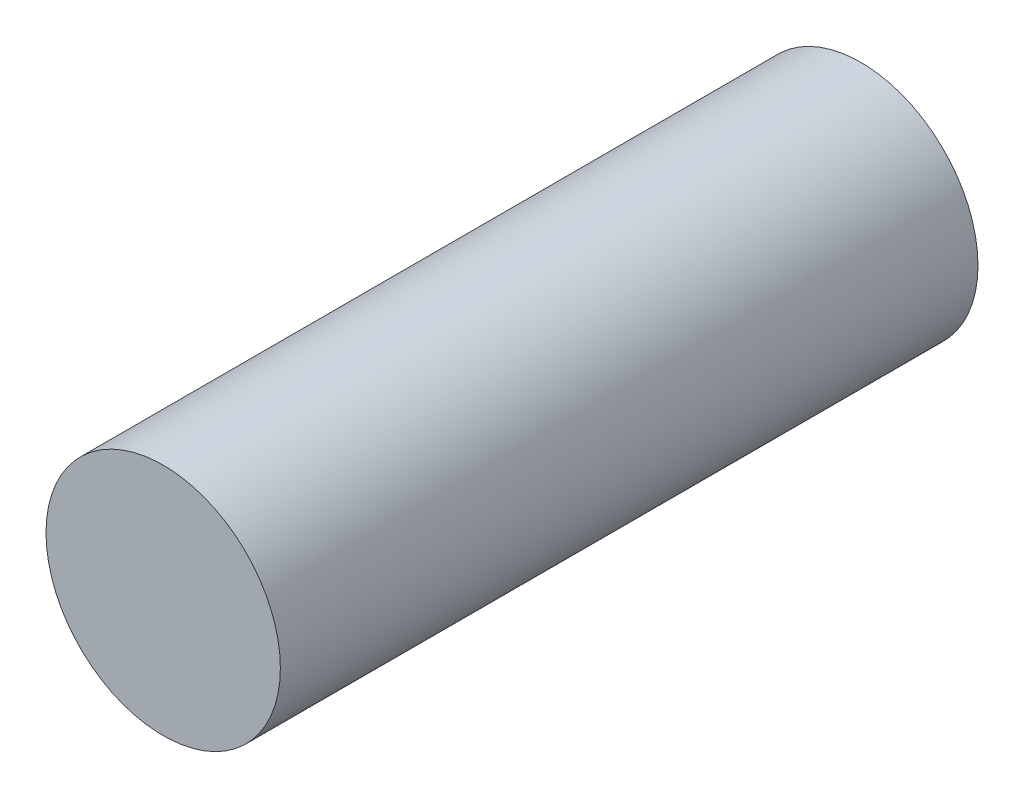
ISO-10303-21;
HEADER;
FILE_DESCRIPTION(('STEP AP214'),'2;1');
FILE_NAME('part.step','',(''),(''),'','','');
FILE_SCHEMA(('AUTOMOTIVE_DESIGN { 1 0 10303 214 1 1 1 1 }'));
ENDSEC;
DATA;
#1=APPLICATION_CONTEXT('core data for automotive mechanical design processes');
#2=APPLICATION_PROTOCOL_DEFINITION('international standard','automotive_design',2000,#1);
#3=PRODUCT_CONTEXT('',#1,'mechanical');
#4=PRODUCT('Part','Part','',(#3));
#5=PRODUCT_RELATED_PRODUCT_CATEGORY('part','',(#4));
#6=PRODUCT_DEFINITION_FORMATION('','',#4);
#7=PRODUCT_DEFINITION_CONTEXT('part definition',#1,'design');
#8=PRODUCT_DEFINITION('design','',#6,#7);
#9=PRODUCT_DEFINITION_SHAPE('','',#8);
#10=(LENGTH_UNIT() NAMED_UNIT(*) SI_UNIT(.MILLI.,.METRE.));
#11=(NAMED_UNIT(*) PLANE_ANGLE_UNIT() SI_UNIT($,.RADIAN.));
#12=(NAMED_UNIT(*) SI_UNIT($,.STERADIAN.) SOLID_ANGLE_UNIT());
#13=UNCERTAINTY_MEASURE_WITH_UNIT(LENGTH_MEASURE(1.E-05),#10,'distance_accuracy_value','');
#14=(GEOMETRIC_REPRESENTATION_CONTEXT(3) GLOBAL_UNCERTAINTY_ASSIGNED_CONTEXT((#13)) GLOBAL_UNIT_ASSIGNED_CONTEXT((#10,
#11,#12)) REPRESENTATION_CONTEXT('',''));
#15=CARTESIAN_POINT('',(0.,0.,0.));
#16=DIRECTION('',(0.,0.,1.));
#17=DIRECTION('',(1.,0.,0.));
#18=AXIS2_PLACEMENT_3D('',#15,#16,#17);
#19=CARTESIAN_POINT('',(0.,0.,17.86));
#20=DIRECTION('',(0.,0.,-1.));
#21=DIRECTION('',(-1.,0.,0.));
#22=AXIS2_PLACEMENT_3D('',#19,#20,#21);
#23=CYLINDRICAL_SURFACE('',#22,3.);
#24=CARTESIAN_POINT('',(0.,0.,17.86));
#25=DIRECTION('',(0.,0.,1.));
#26=DIRECTION('',(1.,0.,0.));
#27=AXIS2_PLACEMENT_3D('',#24,#25,#26);
#28=CIRCLE('',#27,3.);
#29=CARTESIAN_POINT('',(3.,0.,17.86));
#30=VERTEX_POINT('',#29);
#31=EDGE_CURVE('E10',#30,#30,#28,.T.);
#32=ORIENTED_EDGE('',*,*,#31,.F.);
#33=EDGE_LOOP('',(#32));
#34=FACE_BOUND('',#33,.T.);
#35=CARTESIAN_POINT('',(0.,0.,0.));
#36=DIRECTION('',(0.,0.,1.));
#37=DIRECTION('',(1.,0.,0.));
#38=AXIS2_PLACEMENT_3D('',#35,#36,#37);
#39=CIRCLE('',#38,3.);
#40=CARTESIAN_POINT('',(3.,0.,0.));
#41=VERTEX_POINT('',#40);
#42=EDGE_CURVE('E44',#41,#41,#39,.T.);
#43=ORIENTED_EDGE('',*,*,#42,.T.);
#44=EDGE_LOOP('',(#43));
#45=FACE_BOUND('',#44,.T.);
#46=ADVANCED_FACE('F41',(#34,#45),#23,.T.);
#47=CARTESIAN_POINT('',(0.,0.,17.86));
#48=DIRECTION('',(0.,0.,1.));
#49=DIRECTION('',(1.,0.,0.));
#50=AXIS2_PLACEMENT_3D('',#47,#48,#49);
#51=PLANE('',#50);
#52=ORIENTED_EDGE('',*,*,#31,.T.);
#53=EDGE_LOOP('',(#52));
#54=FACE_BOUND('',#53,.T.);
#55=ADVANCED_FACE('F56',(#54),#51,.T.);
#56=CARTESIAN_POINT('',(0.,0.,0.));
#57=DIRECTION('',(0.,0.,1.));
#58=DIRECTION('',(1.,0.,0.));
#59=AXIS2_PLACEMENT_3D('',#56,#57,#58);
#60=PLANE('',#59);
#61=ORIENTED_EDGE('',*,*,#42,.F.);
#62=EDGE_LOOP('',(#61));
#63=FACE_BOUND('',#62,.T.);
#64=ADVANCED_FACE('F54',(#63),#60,.F.);
#65=CLOSED_SHELL('',(#46,#55,#64));
#66=MANIFOLD_SOLID_BREP('B2',#65);
#67=ADVANCED_BREP_SHAPE_REPRESENTATION('',(#18,#66),#14);
#68=SHAPE_DEFINITION_REPRESENTATION(#9,#67);
ENDSEC;
END-ISO-10303-21;
